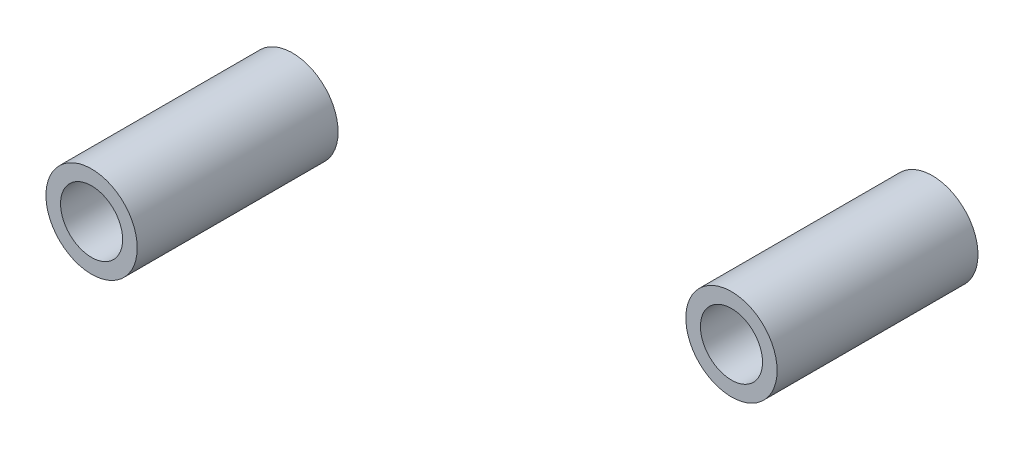
ISO-10303-21;
HEADER;
FILE_DESCRIPTION(('STEP AP214'),'2;1');
FILE_NAME('part.step','',(''),(''),'','','');
FILE_SCHEMA(('AUTOMOTIVE_DESIGN { 1 0 10303 214 1 1 1 1 }'));
ENDSEC;
DATA;
#1=APPLICATION_CONTEXT('core data for automotive mechanical design processes');
#2=APPLICATION_PROTOCOL_DEFINITION('international standard','automotive_design',2000,#1);
#3=PRODUCT_CONTEXT('',#1,'mechanical');
#4=PRODUCT('Part','Part','',(#3));
#5=PRODUCT_RELATED_PRODUCT_CATEGORY('part','',(#4));
#6=PRODUCT_DEFINITION_FORMATION('','',#4);
#7=PRODUCT_DEFINITION_CONTEXT('part definition',#1,'design');
#8=PRODUCT_DEFINITION('design','',#6,#7);
#9=PRODUCT_DEFINITION_SHAPE('','',#8);
#10=(LENGTH_UNIT() NAMED_UNIT(*) SI_UNIT(.MILLI.,.METRE.));
#11=(NAMED_UNIT(*) PLANE_ANGLE_UNIT() SI_UNIT($,.RADIAN.));
#12=(NAMED_UNIT(*) SI_UNIT($,.STERADIAN.) SOLID_ANGLE_UNIT());
#13=UNCERTAINTY_MEASURE_WITH_UNIT(LENGTH_MEASURE(1.E-05),#10,'distance_accuracy_value','');
#14=(GEOMETRIC_REPRESENTATION_CONTEXT(3) GLOBAL_UNCERTAINTY_ASSIGNED_CONTEXT((#13)) GLOBAL_UNIT_ASSIGNED_CONTEXT((#10,
#11,#12)) REPRESENTATION_CONTEXT('',''));
#15=CARTESIAN_POINT('',(0.,0.,0.));
#16=DIRECTION('',(0.,0.,1.));
#17=DIRECTION('',(1.,0.,0.));
#18=AXIS2_PLACEMENT_3D('',#15,#16,#17);
#19=CARTESIAN_POINT('',(280.050647311647,41.4224371043051,358.5));
#20=DIRECTION('',(0.,0.,1.));
#21=DIRECTION('',(1.,0.,0.));
#22=AXIS2_PLACEMENT_3D('',#19,#20,#21);
#23=PLANE('',#22);
#24=CARTESIAN_POINT('',(280.050647311647,41.4224371043051,358.5));
#25=DIRECTION('',(0.,0.,1.));
#26=DIRECTION('',(1.,0.,0.));
#27=AXIS2_PLACEMENT_3D('',#24,#25,#26);
#28=CIRCLE('',#27,2.5);
#29=CARTESIAN_POINT('',(282.550647311647,41.4224371043051,358.5));
#30=VERTEX_POINT('',#29);
#31=EDGE_CURVE('E11',#30,#30,#28,.T.);
#32=ORIENTED_EDGE('',*,*,#31,.T.);
#33=EDGE_LOOP('',(#32));
#34=FACE_BOUND('',#33,.T.);
#35=CARTESIAN_POINT('',(280.050647311647,41.4224371043051,358.5));
#36=DIRECTION('',(0.,0.,1.));
#37=DIRECTION('',(1.,0.,0.));
#38=AXIS2_PLACEMENT_3D('',#35,#36,#37);
#39=CIRCLE('',#38,1.69999999999998);
#40=CARTESIAN_POINT('',(281.750647311647,41.4224371043051,358.5));
#41=VERTEX_POINT('',#40);
#42=EDGE_CURVE('E56',#41,#41,#39,.T.);
#43=ORIENTED_EDGE('',*,*,#42,.F.);
#44=EDGE_LOOP('',(#43));
#45=FACE_BOUND('',#44,.T.);
#46=ADVANCED_FACE('F45',(#34,#45),#23,.T.);
#47=CARTESIAN_POINT('',(280.050647311647,41.4224371043051,347.5));
#48=DIRECTION('',(0.,0.,1.));
#49=DIRECTION('',(1.,0.,0.));
#50=AXIS2_PLACEMENT_3D('',#47,#48,#49);
#51=PLANE('',#50);
#52=CARTESIAN_POINT('',(280.050647311647,41.4224371043051,347.5));
#53=DIRECTION('',(0.,0.,1.));
#54=DIRECTION('',(1.,0.,0.));
#55=AXIS2_PLACEMENT_3D('',#52,#53,#54);
#56=CIRCLE('',#55,2.5);
#57=CARTESIAN_POINT('',(282.550647311647,41.4224371043051,347.5));
#58=VERTEX_POINT('',#57);
#59=EDGE_CURVE('E49',#58,#58,#56,.T.);
#60=ORIENTED_EDGE('',*,*,#59,.F.);
#61=EDGE_LOOP('',(#60));
#62=FACE_BOUND('',#61,.T.);
#63=CARTESIAN_POINT('',(280.050647311647,41.4224371043051,347.5));
#64=DIRECTION('',(0.,0.,1.));
#65=DIRECTION('',(1.,0.,0.));
#66=AXIS2_PLACEMENT_3D('',#63,#64,#65);
#67=CIRCLE('',#66,1.69999999999998);
#68=CARTESIAN_POINT('',(281.750647311647,41.4224371043051,347.5));
#69=VERTEX_POINT('',#68);
#70=EDGE_CURVE('E58',#69,#69,#67,.T.);
#71=ORIENTED_EDGE('',*,*,#70,.T.);
#72=EDGE_LOOP('',(#71));
#73=FACE_BOUND('',#72,.T.);
#74=ADVANCED_FACE('F68',(#62,#73),#51,.F.);
#75=CARTESIAN_POINT('',(280.050647311647,41.4224371043051,358.5));
#76=DIRECTION('',(0.,0.,-1.));
#77=DIRECTION('',(-1.,0.,0.));
#78=AXIS2_PLACEMENT_3D('',#75,#76,#77);
#79=CYLINDRICAL_SURFACE('',#78,2.5);
#80=ORIENTED_EDGE('',*,*,#31,.F.);
#81=EDGE_LOOP('',(#80));
#82=FACE_BOUND('',#81,.T.);
#83=ORIENTED_EDGE('',*,*,#59,.T.);
#84=EDGE_LOOP('',(#83));
#85=FACE_BOUND('',#84,.T.);
#86=ADVANCED_FACE('F47',(#82,#85),#79,.T.);
#87=CARTESIAN_POINT('',(280.050647311647,41.4224371043051,358.5));
#88=DIRECTION('',(0.,0.,-1.));
#89=DIRECTION('',(-1.,0.,0.));
#90=AXIS2_PLACEMENT_3D('',#87,#88,#89);
#91=CYLINDRICAL_SURFACE('',#90,1.69999999999998);
#92=ORIENTED_EDGE('',*,*,#42,.T.);
#93=EDGE_LOOP('',(#92));
#94=FACE_BOUND('',#93,.T.);
#95=ORIENTED_EDGE('',*,*,#70,.F.);
#96=EDGE_LOOP('',(#95));
#97=FACE_BOUND('',#96,.T.);
#98=ADVANCED_FACE('F64',(#94,#97),#91,.F.);
#99=CLOSED_SHELL('',(#46,#74,#86,#98));
#100=MANIFOLD_SOLID_BREP('B2',#99);
#101=CARTESIAN_POINT('',(315.090923202436,53.1249395007438,358.5));
#102=DIRECTION('',(0.,0.,1.));
#103=DIRECTION('',(1.,0.,0.));
#104=AXIS2_PLACEMENT_3D('',#101,#102,#103);
#105=PLANE('',#104);
#106=CARTESIAN_POINT('',(315.090923202436,53.1249395007438,358.5));
#107=DIRECTION('',(0.,0.,1.));
#108=DIRECTION('',(1.,0.,0.));
#109=AXIS2_PLACEMENT_3D('',#106,#107,#108);
#110=CIRCLE('',#109,2.5);
#111=CARTESIAN_POINT('',(317.590923202436,53.1249395007438,358.5));
#112=VERTEX_POINT('',#111);
#113=EDGE_CURVE('E44',#112,#112,#110,.T.);
#114=ORIENTED_EDGE('',*,*,#113,.T.);
#115=EDGE_LOOP('',(#114));
#116=FACE_BOUND('',#115,.T.);
#117=CARTESIAN_POINT('',(315.090923202436,53.1249395007438,358.5));
#118=DIRECTION('',(0.,0.,1.));
#119=DIRECTION('',(1.,0.,0.));
#120=AXIS2_PLACEMENT_3D('',#117,#118,#119);
#121=CIRCLE('',#120,1.69999999999998);
#122=CARTESIAN_POINT('',(316.790923202436,53.1249395007438,358.5));
#123=VERTEX_POINT('',#122);
#124=EDGE_CURVE('E118',#123,#123,#121,.T.);
#125=ORIENTED_EDGE('',*,*,#124,.F.);
#126=EDGE_LOOP('',(#125));
#127=FACE_BOUND('',#126,.T.);
#128=ADVANCED_FACE('F107',(#116,#127),#105,.T.);
#129=CARTESIAN_POINT('',(315.090923202436,53.1249395007438,347.5));
#130=DIRECTION('',(0.,0.,1.));
#131=DIRECTION('',(1.,0.,0.));
#132=AXIS2_PLACEMENT_3D('',#129,#130,#131);
#133=PLANE('',#132);
#134=CARTESIAN_POINT('',(315.090923202436,53.1249395007438,347.5));
#135=DIRECTION('',(0.,0.,1.));
#136=DIRECTION('',(1.,0.,0.));
#137=AXIS2_PLACEMENT_3D('',#134,#135,#136);
#138=CIRCLE('',#137,2.5);
#139=CARTESIAN_POINT('',(317.590923202436,53.1249395007438,347.5));
#140=VERTEX_POINT('',#139);
#141=EDGE_CURVE('E111',#140,#140,#138,.T.);
#142=ORIENTED_EDGE('',*,*,#141,.F.);
#143=EDGE_LOOP('',(#142));
#144=FACE_BOUND('',#143,.T.);
#145=CARTESIAN_POINT('',(315.090923202436,53.1249395007438,347.5));
#146=DIRECTION('',(0.,0.,1.));
#147=DIRECTION('',(1.,0.,0.));
#148=AXIS2_PLACEMENT_3D('',#145,#146,#147);
#149=CIRCLE('',#148,1.69999999999998);
#150=CARTESIAN_POINT('',(316.790923202436,53.1249395007438,347.5));
#151=VERTEX_POINT('',#150);
#152=EDGE_CURVE('E120',#151,#151,#149,.T.);
#153=ORIENTED_EDGE('',*,*,#152,.T.);
#154=EDGE_LOOP('',(#153));
#155=FACE_BOUND('',#154,.T.);
#156=ADVANCED_FACE('F130',(#144,#155),#133,.F.);
#157=CARTESIAN_POINT('',(315.090923202436,53.1249395007438,358.5));
#158=DIRECTION('',(0.,0.,-1.));
#159=DIRECTION('',(-1.,0.,0.));
#160=AXIS2_PLACEMENT_3D('',#157,#158,#159);
#161=CYLINDRICAL_SURFACE('',#160,2.5);
#162=ORIENTED_EDGE('',*,*,#113,.F.);
#163=EDGE_LOOP('',(#162));
#164=FACE_BOUND('',#163,.T.);
#165=ORIENTED_EDGE('',*,*,#141,.T.);
#166=EDGE_LOOP('',(#165));
#167=FACE_BOUND('',#166,.T.);
#168=ADVANCED_FACE('F109',(#164,#167),#161,.T.);
#169=CARTESIAN_POINT('',(315.090923202436,53.1249395007438,358.5));
#170=DIRECTION('',(0.,0.,-1.));
#171=DIRECTION('',(-1.,0.,0.));
#172=AXIS2_PLACEMENT_3D('',#169,#170,#171);
#173=CYLINDRICAL_SURFACE('',#172,1.69999999999998);
#174=ORIENTED_EDGE('',*,*,#124,.T.);
#175=EDGE_LOOP('',(#174));
#176=FACE_BOUND('',#175,.T.);
#177=ORIENTED_EDGE('',*,*,#152,.F.);
#178=EDGE_LOOP('',(#177));
#179=FACE_BOUND('',#178,.T.);
#180=ADVANCED_FACE('F126',(#176,#179),#173,.F.);
#181=CLOSED_SHELL('',(#128,#156,#168,#180));
#182=MANIFOLD_SOLID_BREP('B6',#181);
#183=ADVANCED_BREP_SHAPE_REPRESENTATION('',(#18,#100,#182),#14);
#184=SHAPE_DEFINITION_REPRESENTATION(#9,#183);
ENDSEC;
END-ISO-10303-21;
